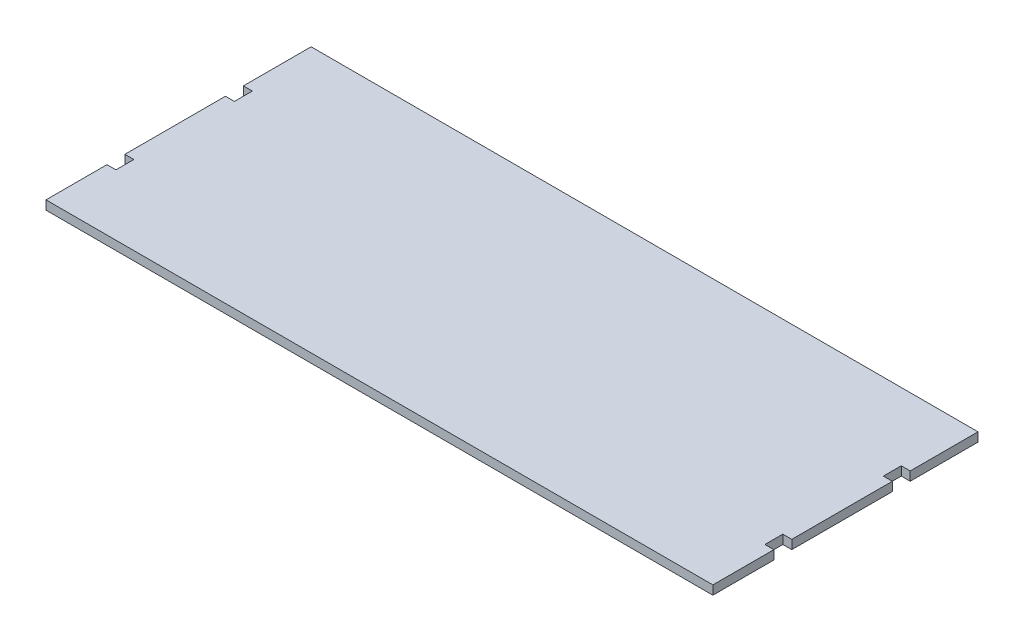
ISO-10303-21;
HEADER;
FILE_DESCRIPTION(('STEP AP214'),'2;1');
FILE_NAME('part.step','',(''),(''),'','','');
FILE_SCHEMA(('AUTOMOTIVE_DESIGN { 1 0 10303 214 1 1 1 1 }'));
ENDSEC;
DATA;
#1=APPLICATION_CONTEXT('core data for automotive mechanical design processes');
#2=APPLICATION_PROTOCOL_DEFINITION('international standard','automotive_design',2000,#1);
#3=PRODUCT_CONTEXT('',#1,'mechanical');
#4=PRODUCT('Part','Part','',(#3));
#5=PRODUCT_RELATED_PRODUCT_CATEGORY('part','',(#4));
#6=PRODUCT_DEFINITION_FORMATION('','',#4);
#7=PRODUCT_DEFINITION_CONTEXT('part definition',#1,'design');
#8=PRODUCT_DEFINITION('design','',#6,#7);
#9=PRODUCT_DEFINITION_SHAPE('','',#8);
#10=(LENGTH_UNIT() NAMED_UNIT(*) SI_UNIT(.MILLI.,.METRE.));
#11=(NAMED_UNIT(*) PLANE_ANGLE_UNIT() SI_UNIT($,.RADIAN.));
#12=(NAMED_UNIT(*) SI_UNIT($,.STERADIAN.) SOLID_ANGLE_UNIT());
#13=UNCERTAINTY_MEASURE_WITH_UNIT(LENGTH_MEASURE(1.E-05),#10,'distance_accuracy_value','');
#14=(GEOMETRIC_REPRESENTATION_CONTEXT(3) GLOBAL_UNCERTAINTY_ASSIGNED_CONTEXT((#13)) GLOBAL_UNIT_ASSIGNED_CONTEXT((#10,
#11,#12)) REPRESENTATION_CONTEXT('',''));
#15=CARTESIAN_POINT('',(0.,0.,0.));
#16=DIRECTION('',(0.,0.,1.));
#17=DIRECTION('',(1.,0.,0.));
#18=AXIS2_PLACEMENT_3D('',#15,#16,#17);
#19=CARTESIAN_POINT('',(-186.,5.,-36.145));
#20=DIRECTION('',(1.,0.,0.));
#21=DIRECTION('',(0.,0.,-1.));
#22=AXIS2_PLACEMENT_3D('',#19,#20,#21);
#23=PLANE('',#22);
#24=DIRECTION('',(0.,0.,1.));
#25=VECTOR('',#24,1.);
#26=CARTESIAN_POINT('',(-186.,0.,-36.145));
#27=LINE('',#26,#25);
#28=CARTESIAN_POINT('',(-186.,0.,-73.945));
#29=VERTEX_POINT('',#28);
#30=CARTESIAN_POINT('',(-186.,0.,-36.145));
#31=VERTEX_POINT('',#30);
#32=EDGE_CURVE('E212',#29,#31,#27,.T.);
#33=ORIENTED_EDGE('',*,*,#32,.T.);
#34=DIRECTION('',(0.,-1.,0.));
#35=VECTOR('',#34,1.);
#36=CARTESIAN_POINT('',(-186.,5.,-36.145));
#37=LINE('',#36,#35);
#38=CARTESIAN_POINT('',(-186.,5.,-36.145));
#39=VERTEX_POINT('',#38);
#40=EDGE_CURVE('E11',#39,#31,#37,.T.);
#41=ORIENTED_EDGE('',*,*,#40,.F.);
#42=DIRECTION('',(0.,0.,1.));
#43=VECTOR('',#42,1.);
#44=CARTESIAN_POINT('',(-186.,5.,-36.145));
#45=LINE('',#44,#43);
#46=CARTESIAN_POINT('',(-186.,5.,-73.945));
#47=VERTEX_POINT('',#46);
#48=EDGE_CURVE('E270',#47,#39,#45,.T.);
#49=ORIENTED_EDGE('',*,*,#48,.F.);
#50=DIRECTION('',(0.,-1.,0.));
#51=VECTOR('',#50,1.);
#52=CARTESIAN_POINT('',(-186.,5.,-73.945));
#53=LINE('',#52,#51);
#54=EDGE_CURVE('E208',#47,#29,#53,.T.);
#55=ORIENTED_EDGE('',*,*,#54,.T.);
#56=EDGE_LOOP('',(#33,#41,#49,#55));
#57=FACE_BOUND('',#56,.T.);
#58=ADVANCED_FACE('F39',(#57),#23,.F.);
#59=CARTESIAN_POINT('',(-186.,5.,-36.145));
#60=DIRECTION('',(0.,0.,-1.));
#61=DIRECTION('',(-1.,0.,0.));
#62=AXIS2_PLACEMENT_3D('',#59,#60,#61);
#63=PLANE('',#62);
#64=DIRECTION('',(1.,0.,0.));
#65=VECTOR('',#64,1.);
#66=CARTESIAN_POINT('',(-186.,0.,-36.145));
#67=LINE('',#66,#65);
#68=CARTESIAN_POINT('',(-181.,0.,-36.145));
#69=VERTEX_POINT('',#68);
#70=EDGE_CURVE('E216',#31,#69,#67,.T.);
#71=ORIENTED_EDGE('',*,*,#70,.T.);
#72=DIRECTION('',(0.,-1.,0.));
#73=VECTOR('',#72,1.);
#74=CARTESIAN_POINT('',(-181.,5.,-36.145));
#75=LINE('',#74,#73);
#76=CARTESIAN_POINT('',(-181.,5.,-36.145));
#77=VERTEX_POINT('',#76);
#78=EDGE_CURVE('E48',#77,#69,#75,.T.);
#79=ORIENTED_EDGE('',*,*,#78,.F.);
#80=DIRECTION('',(1.,0.,0.));
#81=VECTOR('',#80,1.);
#82=CARTESIAN_POINT('',(-186.,5.,-36.145));
#83=LINE('',#82,#81);
#84=EDGE_CURVE('E135',#39,#77,#83,.T.);
#85=ORIENTED_EDGE('',*,*,#84,.F.);
#86=ORIENTED_EDGE('',*,*,#40,.T.);
#87=EDGE_LOOP('',(#71,#79,#85,#86));
#88=FACE_BOUND('',#87,.T.);
#89=ADVANCED_FACE('F420',(#88),#63,.F.);
#90=CARTESIAN_POINT('',(-181.,5.,-36.145));
#91=DIRECTION('',(1.,0.,0.));
#92=DIRECTION('',(0.,0.,-1.));
#93=AXIS2_PLACEMENT_3D('',#90,#91,#92);
#94=PLANE('',#93);
#95=DIRECTION('',(0.,0.,1.));
#96=VECTOR('',#95,1.);
#97=CARTESIAN_POINT('',(-181.,0.,-36.145));
#98=LINE('',#97,#96);
#99=CARTESIAN_POINT('',(-181.,0.,-26.145));
#100=VERTEX_POINT('',#99);
#101=EDGE_CURVE('E219',#69,#100,#98,.T.);
#102=ORIENTED_EDGE('',*,*,#101,.T.);
#103=DIRECTION('',(0.,-1.,0.));
#104=VECTOR('',#103,1.);
#105=CARTESIAN_POINT('',(-181.,5.,-26.145));
#106=LINE('',#105,#104);
#107=CARTESIAN_POINT('',(-181.,5.,-26.145));
#108=VERTEX_POINT('',#107);
#109=EDGE_CURVE('E329',#108,#100,#106,.T.);
#110=ORIENTED_EDGE('',*,*,#109,.F.);
#111=DIRECTION('',(0.,0.,1.));
#112=VECTOR('',#111,1.);
#113=CARTESIAN_POINT('',(-181.,5.,-36.145));
#114=LINE('',#113,#112);
#115=EDGE_CURVE('E339',#77,#108,#114,.T.);
#116=ORIENTED_EDGE('',*,*,#115,.F.);
#117=ORIENTED_EDGE('',*,*,#78,.T.);
#118=EDGE_LOOP('',(#102,#110,#116,#117));
#119=FACE_BOUND('',#118,.T.);
#120=ADVANCED_FACE('F337',(#119),#94,.F.);
#121=CARTESIAN_POINT('',(-181.,5.,-26.145));
#122=DIRECTION('',(0.,0.,1.));
#123=DIRECTION('',(1.,0.,0.));
#124=AXIS2_PLACEMENT_3D('',#121,#122,#123);
#125=PLANE('',#124);
#126=DIRECTION('',(-1.,0.,0.));
#127=VECTOR('',#126,1.);
#128=CARTESIAN_POINT('',(-181.,0.,-26.145));
#129=LINE('',#128,#127);
#130=CARTESIAN_POINT('',(-186.,0.,-26.145));
#131=VERTEX_POINT('',#130);
#132=EDGE_CURVE('E222',#100,#131,#129,.T.);
#133=ORIENTED_EDGE('',*,*,#132,.T.);
#134=DIRECTION('',(0.,-1.,0.));
#135=VECTOR('',#134,1.);
#136=CARTESIAN_POINT('',(-186.,5.,-26.145));
#137=LINE('',#136,#135);
#138=CARTESIAN_POINT('',(-186.,5.,-26.145));
#139=VERTEX_POINT('',#138);
#140=EDGE_CURVE('E325',#139,#131,#137,.T.);
#141=ORIENTED_EDGE('',*,*,#140,.F.);
#142=DIRECTION('',(-1.,0.,0.));
#143=VECTOR('',#142,1.);
#144=CARTESIAN_POINT('',(-181.,5.,-26.145));
#145=LINE('',#144,#143);
#146=EDGE_CURVE('E358',#108,#139,#145,.T.);
#147=ORIENTED_EDGE('',*,*,#146,.F.);
#148=ORIENTED_EDGE('',*,*,#109,.T.);
#149=EDGE_LOOP('',(#133,#141,#147,#148));
#150=FACE_BOUND('',#149,.T.);
#151=ADVANCED_FACE('F348',(#150),#125,.F.);
#152=CARTESIAN_POINT('',(-186.,5.,29.945));
#153=DIRECTION('',(1.,0.,0.));
#154=DIRECTION('',(0.,0.,-1.));
#155=AXIS2_PLACEMENT_3D('',#152,#153,#154);
#156=PLANE('',#155);
#157=DIRECTION('',(0.,0.,1.));
#158=VECTOR('',#157,1.);
#159=CARTESIAN_POINT('',(-186.,0.,29.945));
#160=LINE('',#159,#158);
#161=CARTESIAN_POINT('',(-186.,0.,29.945));
#162=VERTEX_POINT('',#161);
#163=EDGE_CURVE('E225',#131,#162,#160,.T.);
#164=ORIENTED_EDGE('',*,*,#163,.T.);
#165=DIRECTION('',(0.,-1.,0.));
#166=VECTOR('',#165,1.);
#167=CARTESIAN_POINT('',(-186.,5.,29.945));
#168=LINE('',#167,#166);
#169=CARTESIAN_POINT('',(-186.,5.,29.945));
#170=VERTEX_POINT('',#169);
#171=EDGE_CURVE('E321',#170,#162,#168,.T.);
#172=ORIENTED_EDGE('',*,*,#171,.F.);
#173=DIRECTION('',(0.,0.,1.));
#174=VECTOR('',#173,1.);
#175=CARTESIAN_POINT('',(-186.,5.,29.945));
#176=LINE('',#175,#174);
#177=EDGE_CURVE('E354',#139,#170,#176,.T.);
#178=ORIENTED_EDGE('',*,*,#177,.F.);
#179=ORIENTED_EDGE('',*,*,#140,.T.);
#180=EDGE_LOOP('',(#164,#172,#178,#179));
#181=FACE_BOUND('',#180,.T.);
#182=ADVANCED_FACE('F352',(#181),#156,.F.);
#183=CARTESIAN_POINT('',(-181.,5.,29.945));
#184=DIRECTION('',(0.,0.,-1.));
#185=DIRECTION('',(-1.,0.,0.));
#186=AXIS2_PLACEMENT_3D('',#183,#184,#185);
#187=PLANE('',#186);
#188=DIRECTION('',(1.,0.,0.));
#189=VECTOR('',#188,1.);
#190=CARTESIAN_POINT('',(-181.,0.,29.945));
#191=LINE('',#190,#189);
#192=CARTESIAN_POINT('',(-181.,0.,29.945));
#193=VERTEX_POINT('',#192);
#194=EDGE_CURVE('E228',#162,#193,#191,.T.);
#195=ORIENTED_EDGE('',*,*,#194,.T.);
#196=DIRECTION('',(0.,-1.,0.));
#197=VECTOR('',#196,1.);
#198=CARTESIAN_POINT('',(-181.,5.,29.945));
#199=LINE('',#198,#197);
#200=CARTESIAN_POINT('',(-181.,5.,29.945));
#201=VERTEX_POINT('',#200);
#202=EDGE_CURVE('E317',#201,#193,#199,.T.);
#203=ORIENTED_EDGE('',*,*,#202,.F.);
#204=DIRECTION('',(1.,0.,0.));
#205=VECTOR('',#204,1.);
#206=CARTESIAN_POINT('',(-181.,5.,29.945));
#207=LINE('',#206,#205);
#208=EDGE_CURVE('E357',#170,#201,#207,.T.);
#209=ORIENTED_EDGE('',*,*,#208,.F.);
#210=ORIENTED_EDGE('',*,*,#171,.T.);
#211=EDGE_LOOP('',(#195,#203,#209,#210));
#212=FACE_BOUND('',#211,.T.);
#213=ADVANCED_FACE('F433',(#212),#187,.F.);
#214=CARTESIAN_POINT('',(-181.,5.,39.945));
#215=DIRECTION('',(1.,0.,0.));
#216=DIRECTION('',(0.,0.,-1.));
#217=AXIS2_PLACEMENT_3D('',#214,#215,#216);
#218=PLANE('',#217);
#219=DIRECTION('',(0.,0.,1.));
#220=VECTOR('',#219,1.);
#221=CARTESIAN_POINT('',(-181.,0.,39.945));
#222=LINE('',#221,#220);
#223=CARTESIAN_POINT('',(-181.,0.,39.945));
#224=VERTEX_POINT('',#223);
#225=EDGE_CURVE('E231',#193,#224,#222,.T.);
#226=ORIENTED_EDGE('',*,*,#225,.T.);
#227=DIRECTION('',(0.,-1.,0.));
#228=VECTOR('',#227,1.);
#229=CARTESIAN_POINT('',(-181.,5.,39.945));
#230=LINE('',#229,#228);
#231=CARTESIAN_POINT('',(-181.,5.,39.945));
#232=VERTEX_POINT('',#231);
#233=EDGE_CURVE('E313',#232,#224,#230,.T.);
#234=ORIENTED_EDGE('',*,*,#233,.F.);
#235=DIRECTION('',(0.,0.,1.));
#236=VECTOR('',#235,1.);
#237=CARTESIAN_POINT('',(-181.,5.,39.945));
#238=LINE('',#237,#236);
#239=EDGE_CURVE('E362',#201,#232,#238,.T.);
#240=ORIENTED_EDGE('',*,*,#239,.F.);
#241=ORIENTED_EDGE('',*,*,#202,.T.);
#242=EDGE_LOOP('',(#226,#234,#240,#241));
#243=FACE_BOUND('',#242,.T.);
#244=ADVANCED_FACE('F436',(#243),#218,.F.);
#245=CARTESIAN_POINT('',(-186.,5.,39.945));
#246=DIRECTION('',(0.,0.,1.));
#247=DIRECTION('',(1.,0.,0.));
#248=AXIS2_PLACEMENT_3D('',#245,#246,#247);
#249=PLANE('',#248);
#250=DIRECTION('',(-1.,0.,0.));
#251=VECTOR('',#250,1.);
#252=CARTESIAN_POINT('',(-186.,0.,39.945));
#253=LINE('',#252,#251);
#254=CARTESIAN_POINT('',(-186.,0.,39.945));
#255=VERTEX_POINT('',#254);
#256=EDGE_CURVE('E234',#224,#255,#253,.T.);
#257=ORIENTED_EDGE('',*,*,#256,.T.);
#258=DIRECTION('',(0.,-1.,0.));
#259=VECTOR('',#258,1.);
#260=CARTESIAN_POINT('',(-186.,5.,39.945));
#261=LINE('',#260,#259);
#262=CARTESIAN_POINT('',(-186.,5.,39.945));
#263=VERTEX_POINT('',#262);
#264=EDGE_CURVE('E309',#263,#255,#261,.T.);
#265=ORIENTED_EDGE('',*,*,#264,.F.);
#266=DIRECTION('',(-1.,0.,0.));
#267=VECTOR('',#266,1.);
#268=CARTESIAN_POINT('',(-186.,5.,39.945));
#269=LINE('',#268,#267);
#270=EDGE_CURVE('E369',#232,#263,#269,.T.);
#271=ORIENTED_EDGE('',*,*,#270,.F.);
#272=ORIENTED_EDGE('',*,*,#233,.T.);
#273=EDGE_LOOP('',(#257,#265,#271,#272));
#274=FACE_BOUND('',#273,.T.);
#275=ADVANCED_FACE('F440',(#274),#249,.F.);
#276=CARTESIAN_POINT('',(-186.,5.,73.945));
#277=DIRECTION('',(1.,0.,0.));
#278=DIRECTION('',(0.,0.,-1.));
#279=AXIS2_PLACEMENT_3D('',#276,#277,#278);
#280=PLANE('',#279);
#281=DIRECTION('',(0.,0.,1.));
#282=VECTOR('',#281,1.);
#283=CARTESIAN_POINT('',(-186.,0.,73.945));
#284=LINE('',#283,#282);
#285=CARTESIAN_POINT('',(-186.,0.,73.945));
#286=VERTEX_POINT('',#285);
#287=EDGE_CURVE('E237',#255,#286,#284,.T.);
#288=ORIENTED_EDGE('',*,*,#287,.T.);
#289=DIRECTION('',(0.,-1.,0.));
#290=VECTOR('',#289,1.);
#291=CARTESIAN_POINT('',(-186.,5.,73.945));
#292=LINE('',#291,#290);
#293=CARTESIAN_POINT('',(-186.,5.,73.945));
#294=VERTEX_POINT('',#293);
#295=EDGE_CURVE('E305',#294,#286,#292,.T.);
#296=ORIENTED_EDGE('',*,*,#295,.F.);
#297=DIRECTION('',(0.,0.,1.));
#298=VECTOR('',#297,1.);
#299=CARTESIAN_POINT('',(-186.,5.,73.945));
#300=LINE('',#299,#298);
#301=EDGE_CURVE('E372',#263,#294,#300,.T.);
#302=ORIENTED_EDGE('',*,*,#301,.F.);
#303=ORIENTED_EDGE('',*,*,#264,.T.);
#304=EDGE_LOOP('',(#288,#296,#302,#303));
#305=FACE_BOUND('',#304,.T.);
#306=ADVANCED_FACE('F444',(#305),#280,.F.);
#307=CARTESIAN_POINT('',(186.,5.,73.945));
#308=DIRECTION('',(0.,0.,-1.));
#309=DIRECTION('',(-1.,0.,0.));
#310=AXIS2_PLACEMENT_3D('',#307,#308,#309);
#311=PLANE('',#310);
#312=DIRECTION('',(1.,0.,0.));
#313=VECTOR('',#312,1.);
#314=CARTESIAN_POINT('',(186.,0.,73.945));
#315=LINE('',#314,#313);
#316=CARTESIAN_POINT('',(186.,0.,73.945));
#317=VERTEX_POINT('',#316);
#318=EDGE_CURVE('E240',#286,#317,#315,.T.);
#319=ORIENTED_EDGE('',*,*,#318,.T.);
#320=DIRECTION('',(0.,-1.,0.));
#321=VECTOR('',#320,1.);
#322=CARTESIAN_POINT('',(186.,5.,73.945));
#323=LINE('',#322,#321);
#324=CARTESIAN_POINT('',(186.,5.,73.945));
#325=VERTEX_POINT('',#324);
#326=EDGE_CURVE('E301',#325,#317,#323,.T.);
#327=ORIENTED_EDGE('',*,*,#326,.F.);
#328=DIRECTION('',(1.,0.,0.));
#329=VECTOR('',#328,1.);
#330=CARTESIAN_POINT('',(186.,5.,73.945));
#331=LINE('',#330,#329);
#332=EDGE_CURVE('E375',#294,#325,#331,.T.);
#333=ORIENTED_EDGE('',*,*,#332,.F.);
#334=ORIENTED_EDGE('',*,*,#295,.T.);
#335=EDGE_LOOP('',(#319,#327,#333,#334));
#336=FACE_BOUND('',#335,.T.);
#337=ADVANCED_FACE('F448',(#336),#311,.F.);
#338=CARTESIAN_POINT('',(186.,5.,73.945));
#339=DIRECTION('',(-1.,0.,0.));
#340=DIRECTION('',(0.,0.,1.));
#341=AXIS2_PLACEMENT_3D('',#338,#339,#340);
#342=PLANE('',#341);
#343=DIRECTION('',(0.,0.,-1.));
#344=VECTOR('',#343,1.);
#345=CARTESIAN_POINT('',(186.,0.,73.945));
#346=LINE('',#345,#344);
#347=CARTESIAN_POINT('',(186.,0.,39.945));
#348=VERTEX_POINT('',#347);
#349=EDGE_CURVE('E243',#317,#348,#346,.T.);
#350=ORIENTED_EDGE('',*,*,#349,.T.);
#351=DIRECTION('',(0.,-1.,0.));
#352=VECTOR('',#351,1.);
#353=CARTESIAN_POINT('',(186.,5.,39.945));
#354=LINE('',#353,#352);
#355=CARTESIAN_POINT('',(186.,5.,39.945));
#356=VERTEX_POINT('',#355);
#357=EDGE_CURVE('E297',#356,#348,#354,.T.);
#358=ORIENTED_EDGE('',*,*,#357,.F.);
#359=DIRECTION('',(0.,0.,-1.));
#360=VECTOR('',#359,1.);
#361=CARTESIAN_POINT('',(186.,5.,73.945));
#362=LINE('',#361,#360);
#363=EDGE_CURVE('E378',#325,#356,#362,.T.);
#364=ORIENTED_EDGE('',*,*,#363,.F.);
#365=ORIENTED_EDGE('',*,*,#326,.T.);
#366=EDGE_LOOP('',(#350,#358,#364,#365));
#367=FACE_BOUND('',#366,.T.);
#368=ADVANCED_FACE('F452',(#367),#342,.F.);
#369=CARTESIAN_POINT('',(186.,5.,39.945));
#370=DIRECTION('',(0.,0.,1.));
#371=DIRECTION('',(1.,0.,0.));
#372=AXIS2_PLACEMENT_3D('',#369,#370,#371);
#373=PLANE('',#372);
#374=DIRECTION('',(-1.,0.,0.));
#375=VECTOR('',#374,1.);
#376=CARTESIAN_POINT('',(186.,0.,39.945));
#377=LINE('',#376,#375);
#378=CARTESIAN_POINT('',(181.,0.,39.945));
#379=VERTEX_POINT('',#378);
#380=EDGE_CURVE('E246',#348,#379,#377,.T.);
#381=ORIENTED_EDGE('',*,*,#380,.T.);
#382=DIRECTION('',(0.,-1.,0.));
#383=VECTOR('',#382,1.);
#384=CARTESIAN_POINT('',(181.,5.,39.945));
#385=LINE('',#384,#383);
#386=CARTESIAN_POINT('',(181.,5.,39.945));
#387=VERTEX_POINT('',#386);
#388=EDGE_CURVE('E293',#387,#379,#385,.T.);
#389=ORIENTED_EDGE('',*,*,#388,.F.);
#390=DIRECTION('',(-1.,0.,0.));
#391=VECTOR('',#390,1.);
#392=CARTESIAN_POINT('',(186.,5.,39.945));
#393=LINE('',#392,#391);
#394=EDGE_CURVE('E381',#356,#387,#393,.T.);
#395=ORIENTED_EDGE('',*,*,#394,.F.);
#396=ORIENTED_EDGE('',*,*,#357,.T.);
#397=EDGE_LOOP('',(#381,#389,#395,#396));
#398=FACE_BOUND('',#397,.T.);
#399=ADVANCED_FACE('F456',(#398),#373,.F.);
#400=CARTESIAN_POINT('',(181.,5.,39.945));
#401=DIRECTION('',(-1.,0.,0.));
#402=DIRECTION('',(0.,0.,1.));
#403=AXIS2_PLACEMENT_3D('',#400,#401,#402);
#404=PLANE('',#403);
#405=DIRECTION('',(0.,0.,-1.));
#406=VECTOR('',#405,1.);
#407=CARTESIAN_POINT('',(181.,0.,39.945));
#408=LINE('',#407,#406);
#409=CARTESIAN_POINT('',(181.,0.,29.945));
#410=VERTEX_POINT('',#409);
#411=EDGE_CURVE('E249',#379,#410,#408,.T.);
#412=ORIENTED_EDGE('',*,*,#411,.T.);
#413=DIRECTION('',(0.,-1.,0.));
#414=VECTOR('',#413,1.);
#415=CARTESIAN_POINT('',(181.,5.,29.945));
#416=LINE('',#415,#414);
#417=CARTESIAN_POINT('',(181.,5.,29.945));
#418=VERTEX_POINT('',#417);
#419=EDGE_CURVE('E289',#418,#410,#416,.T.);
#420=ORIENTED_EDGE('',*,*,#419,.F.);
#421=DIRECTION('',(0.,0.,-1.));
#422=VECTOR('',#421,1.);
#423=CARTESIAN_POINT('',(181.,5.,39.945));
#424=LINE('',#423,#422);
#425=EDGE_CURVE('E384',#387,#418,#424,.T.);
#426=ORIENTED_EDGE('',*,*,#425,.F.);
#427=ORIENTED_EDGE('',*,*,#388,.T.);
#428=EDGE_LOOP('',(#412,#420,#426,#427));
#429=FACE_BOUND('',#428,.T.);
#430=ADVANCED_FACE('F460',(#429),#404,.F.);
#431=CARTESIAN_POINT('',(181.,5.,29.945));
#432=DIRECTION('',(0.,0.,-1.));
#433=DIRECTION('',(-1.,0.,0.));
#434=AXIS2_PLACEMENT_3D('',#431,#432,#433);
#435=PLANE('',#434);
#436=DIRECTION('',(1.,0.,0.));
#437=VECTOR('',#436,1.);
#438=CARTESIAN_POINT('',(181.,0.,29.945));
#439=LINE('',#438,#437);
#440=CARTESIAN_POINT('',(186.,0.,29.945));
#441=VERTEX_POINT('',#440);
#442=EDGE_CURVE('E252',#410,#441,#439,.T.);
#443=ORIENTED_EDGE('',*,*,#442,.T.);
#444=DIRECTION('',(0.,-1.,0.));
#445=VECTOR('',#444,1.);
#446=CARTESIAN_POINT('',(186.,5.,29.945));
#447=LINE('',#446,#445);
#448=CARTESIAN_POINT('',(186.,5.,29.945));
#449=VERTEX_POINT('',#448);
#450=EDGE_CURVE('E285',#449,#441,#447,.T.);
#451=ORIENTED_EDGE('',*,*,#450,.F.);
#452=DIRECTION('',(1.,0.,0.));
#453=VECTOR('',#452,1.);
#454=CARTESIAN_POINT('',(181.,5.,29.945));
#455=LINE('',#454,#453);
#456=EDGE_CURVE('E387',#418,#449,#455,.T.);
#457=ORIENTED_EDGE('',*,*,#456,.F.);
#458=ORIENTED_EDGE('',*,*,#419,.T.);
#459=EDGE_LOOP('',(#443,#451,#457,#458));
#460=FACE_BOUND('',#459,.T.);
#461=ADVANCED_FACE('F464',(#460),#435,.F.);
#462=CARTESIAN_POINT('',(186.,5.,29.945));
#463=DIRECTION('',(-1.,0.,0.));
#464=DIRECTION('',(0.,0.,1.));
#465=AXIS2_PLACEMENT_3D('',#462,#463,#464);
#466=PLANE('',#465);
#467=DIRECTION('',(0.,0.,-1.));
#468=VECTOR('',#467,1.);
#469=CARTESIAN_POINT('',(186.,0.,29.945));
#470=LINE('',#469,#468);
#471=CARTESIAN_POINT('',(186.,0.,-26.145));
#472=VERTEX_POINT('',#471);
#473=EDGE_CURVE('E255',#441,#472,#470,.T.);
#474=ORIENTED_EDGE('',*,*,#473,.T.);
#475=DIRECTION('',(0.,-1.,0.));
#476=VECTOR('',#475,1.);
#477=CARTESIAN_POINT('',(186.,5.,-26.145));
#478=LINE('',#477,#476);
#479=CARTESIAN_POINT('',(186.,5.,-26.145));
#480=VERTEX_POINT('',#479);
#481=EDGE_CURVE('E281',#480,#472,#478,.T.);
#482=ORIENTED_EDGE('',*,*,#481,.F.);
#483=DIRECTION('',(0.,0.,-1.));
#484=VECTOR('',#483,1.);
#485=CARTESIAN_POINT('',(186.,5.,29.945));
#486=LINE('',#485,#484);
#487=EDGE_CURVE('E390',#449,#480,#486,.T.);
#488=ORIENTED_EDGE('',*,*,#487,.F.);
#489=ORIENTED_EDGE('',*,*,#450,.T.);
#490=EDGE_LOOP('',(#474,#482,#488,#489));
#491=FACE_BOUND('',#490,.T.);
#492=ADVANCED_FACE('F468',(#491),#466,.F.);
#493=CARTESIAN_POINT('',(181.,5.,-26.145));
#494=DIRECTION('',(0.,0.,1.));
#495=DIRECTION('',(1.,0.,0.));
#496=AXIS2_PLACEMENT_3D('',#493,#494,#495);
#497=PLANE('',#496);
#498=DIRECTION('',(-1.,0.,0.));
#499=VECTOR('',#498,1.);
#500=CARTESIAN_POINT('',(181.,0.,-26.145));
#501=LINE('',#500,#499);
#502=CARTESIAN_POINT('',(181.,0.,-26.145));
#503=VERTEX_POINT('',#502);
#504=EDGE_CURVE('E258',#472,#503,#501,.T.);
#505=ORIENTED_EDGE('',*,*,#504,.T.);
#506=DIRECTION('',(0.,-1.,0.));
#507=VECTOR('',#506,1.);
#508=CARTESIAN_POINT('',(181.,5.,-26.145));
#509=LINE('',#508,#507);
#510=CARTESIAN_POINT('',(181.,5.,-26.145));
#511=VERTEX_POINT('',#510);
#512=EDGE_CURVE('E277',#511,#503,#509,.T.);
#513=ORIENTED_EDGE('',*,*,#512,.F.);
#514=DIRECTION('',(-1.,0.,0.));
#515=VECTOR('',#514,1.);
#516=CARTESIAN_POINT('',(181.,5.,-26.145));
#517=LINE('',#516,#515);
#518=EDGE_CURVE('E393',#480,#511,#517,.T.);
#519=ORIENTED_EDGE('',*,*,#518,.F.);
#520=ORIENTED_EDGE('',*,*,#481,.T.);
#521=EDGE_LOOP('',(#505,#513,#519,#520));
#522=FACE_BOUND('',#521,.T.);
#523=ADVANCED_FACE('F401',(#522),#497,.F.);
#524=CARTESIAN_POINT('',(181.,5.,-36.145));
#525=DIRECTION('',(-1.,0.,0.));
#526=DIRECTION('',(0.,0.,1.));
#527=AXIS2_PLACEMENT_3D('',#524,#525,#526);
#528=PLANE('',#527);
#529=DIRECTION('',(0.,0.,-1.));
#530=VECTOR('',#529,1.);
#531=CARTESIAN_POINT('',(181.,0.,-36.145));
#532=LINE('',#531,#530);
#533=CARTESIAN_POINT('',(181.,0.,-36.145));
#534=VERTEX_POINT('',#533);
#535=EDGE_CURVE('E261',#503,#534,#532,.T.);
#536=ORIENTED_EDGE('',*,*,#535,.T.);
#537=DIRECTION('',(0.,-1.,0.));
#538=VECTOR('',#537,1.);
#539=CARTESIAN_POINT('',(181.,5.,-36.145));
#540=LINE('',#539,#538);
#541=CARTESIAN_POINT('',(181.,5.,-36.145));
#542=VERTEX_POINT('',#541);
#543=EDGE_CURVE('E201',#542,#534,#540,.T.);
#544=ORIENTED_EDGE('',*,*,#543,.F.);
#545=DIRECTION('',(0.,0.,-1.));
#546=VECTOR('',#545,1.);
#547=CARTESIAN_POINT('',(181.,5.,-36.145));
#548=LINE('',#547,#546);
#549=EDGE_CURVE('E190',#511,#542,#548,.T.);
#550=ORIENTED_EDGE('',*,*,#549,.F.);
#551=ORIENTED_EDGE('',*,*,#512,.T.);
#552=EDGE_LOOP('',(#536,#544,#550,#551));
#553=FACE_BOUND('',#552,.T.);
#554=ADVANCED_FACE('F405',(#553),#528,.F.);
#555=CARTESIAN_POINT('',(186.,5.,-36.145));
#556=DIRECTION('',(0.,0.,-1.));
#557=DIRECTION('',(-1.,0.,0.));
#558=AXIS2_PLACEMENT_3D('',#555,#556,#557);
#559=PLANE('',#558);
#560=DIRECTION('',(1.,0.,0.));
#561=VECTOR('',#560,1.);
#562=CARTESIAN_POINT('',(186.,0.,-36.145));
#563=LINE('',#562,#561);
#564=CARTESIAN_POINT('',(186.,0.,-36.145));
#565=VERTEX_POINT('',#564);
#566=EDGE_CURVE('E199',#534,#565,#563,.T.);
#567=ORIENTED_EDGE('',*,*,#566,.T.);
#568=DIRECTION('',(0.,-1.,0.));
#569=VECTOR('',#568,1.);
#570=CARTESIAN_POINT('',(186.,5.,-36.145));
#571=LINE('',#570,#569);
#572=CARTESIAN_POINT('',(186.,5.,-36.145));
#573=VERTEX_POINT('',#572);
#574=EDGE_CURVE('E196',#573,#565,#571,.T.);
#575=ORIENTED_EDGE('',*,*,#574,.F.);
#576=DIRECTION('',(1.,0.,0.));
#577=VECTOR('',#576,1.);
#578=CARTESIAN_POINT('',(186.,5.,-36.145));
#579=LINE('',#578,#577);
#580=EDGE_CURVE('E184',#542,#573,#579,.T.);
#581=ORIENTED_EDGE('',*,*,#580,.F.);
#582=ORIENTED_EDGE('',*,*,#543,.T.);
#583=EDGE_LOOP('',(#567,#575,#581,#582));
#584=FACE_BOUND('',#583,.T.);
#585=ADVANCED_FACE('F197',(#584),#559,.F.);
#586=CARTESIAN_POINT('',(186.,5.,-36.145));
#587=DIRECTION('',(-1.,0.,0.));
#588=DIRECTION('',(0.,0.,1.));
#589=AXIS2_PLACEMENT_3D('',#586,#587,#588);
#590=PLANE('',#589);
#591=DIRECTION('',(0.,0.,-1.));
#592=VECTOR('',#591,1.);
#593=CARTESIAN_POINT('',(186.,0.,-36.145));
#594=LINE('',#593,#592);
#595=CARTESIAN_POINT('',(186.,0.,-73.945));
#596=VERTEX_POINT('',#595);
#597=EDGE_CURVE('E121',#565,#596,#594,.T.);
#598=ORIENTED_EDGE('',*,*,#597,.T.);
#599=DIRECTION('',(0.,-1.,0.));
#600=VECTOR('',#599,1.);
#601=CARTESIAN_POINT('',(186.,5.,-73.945));
#602=LINE('',#601,#600);
#603=CARTESIAN_POINT('',(186.,5.,-73.945));
#604=VERTEX_POINT('',#603);
#605=EDGE_CURVE('E202',#604,#596,#602,.T.);
#606=ORIENTED_EDGE('',*,*,#605,.F.);
#607=DIRECTION('',(0.,0.,-1.));
#608=VECTOR('',#607,1.);
#609=CARTESIAN_POINT('',(186.,5.,-36.145));
#610=LINE('',#609,#608);
#611=EDGE_CURVE('E188',#573,#604,#610,.T.);
#612=ORIENTED_EDGE('',*,*,#611,.F.);
#613=ORIENTED_EDGE('',*,*,#574,.T.);
#614=EDGE_LOOP('',(#598,#606,#612,#613));
#615=FACE_BOUND('',#614,.T.);
#616=ADVANCED_FACE('F204',(#615),#590,.F.);
#617=CARTESIAN_POINT('',(186.,5.,-73.945));
#618=DIRECTION('',(0.,0.,1.));
#619=DIRECTION('',(1.,0.,0.));
#620=AXIS2_PLACEMENT_3D('',#617,#618,#619);
#621=PLANE('',#620);
#622=DIRECTION('',(-1.,0.,0.));
#623=VECTOR('',#622,1.);
#624=CARTESIAN_POINT('',(186.,0.,-73.945));
#625=LINE('',#624,#623);
#626=EDGE_CURVE('E127',#596,#29,#625,.T.);
#627=ORIENTED_EDGE('',*,*,#626,.T.);
#628=ORIENTED_EDGE('',*,*,#54,.F.);
#629=DIRECTION('',(-1.,0.,0.));
#630=VECTOR('',#629,1.);
#631=CARTESIAN_POINT('',(186.,5.,-73.945));
#632=LINE('',#631,#630);
#633=EDGE_CURVE('E56',#604,#47,#632,.T.);
#634=ORIENTED_EDGE('',*,*,#633,.F.);
#635=ORIENTED_EDGE('',*,*,#605,.T.);
#636=EDGE_LOOP('',(#627,#628,#634,#635));
#637=FACE_BOUND('',#636,.T.);
#638=ADVANCED_FACE('F409',(#637),#621,.F.);
#639=CARTESIAN_POINT('',(0.,5.,0.));
#640=DIRECTION('',(0.,1.,0.));
#641=DIRECTION('',(0.,0.,1.));
#642=AXIS2_PLACEMENT_3D('',#639,#640,#641);
#643=PLANE('',#642);
#644=ORIENTED_EDGE('',*,*,#48,.T.);
#645=ORIENTED_EDGE('',*,*,#84,.T.);
#646=ORIENTED_EDGE('',*,*,#115,.T.);
#647=ORIENTED_EDGE('',*,*,#146,.T.);
#648=ORIENTED_EDGE('',*,*,#177,.T.);
#649=ORIENTED_EDGE('',*,*,#208,.T.);
#650=ORIENTED_EDGE('',*,*,#239,.T.);
#651=ORIENTED_EDGE('',*,*,#270,.T.);
#652=ORIENTED_EDGE('',*,*,#301,.T.);
#653=ORIENTED_EDGE('',*,*,#332,.T.);
#654=ORIENTED_EDGE('',*,*,#363,.T.);
#655=ORIENTED_EDGE('',*,*,#394,.T.);
#656=ORIENTED_EDGE('',*,*,#425,.T.);
#657=ORIENTED_EDGE('',*,*,#456,.T.);
#658=ORIENTED_EDGE('',*,*,#487,.T.);
#659=ORIENTED_EDGE('',*,*,#518,.T.);
#660=ORIENTED_EDGE('',*,*,#549,.T.);
#661=ORIENTED_EDGE('',*,*,#580,.T.);
#662=ORIENTED_EDGE('',*,*,#611,.T.);
#663=ORIENTED_EDGE('',*,*,#633,.T.);
#664=EDGE_LOOP('',(#644,#645,#646,#647,#648,#649,#650,#651,#652,#653,#654,#655,#656,#657,#658,
#659,#660,#661,#662,#663));
#665=FACE_BOUND('',#664,.T.);
#666=ADVANCED_FACE('F186',(#665),#643,.T.);
#667=CARTESIAN_POINT('',(0.,0.,0.));
#668=DIRECTION('',(0.,1.,0.));
#669=DIRECTION('',(0.,0.,1.));
#670=AXIS2_PLACEMENT_3D('',#667,#668,#669);
#671=PLANE('',#670);
#672=ORIENTED_EDGE('',*,*,#32,.F.);
#673=ORIENTED_EDGE('',*,*,#626,.F.);
#674=ORIENTED_EDGE('',*,*,#597,.F.);
#675=ORIENTED_EDGE('',*,*,#566,.F.);
#676=ORIENTED_EDGE('',*,*,#535,.F.);
#677=ORIENTED_EDGE('',*,*,#504,.F.);
#678=ORIENTED_EDGE('',*,*,#473,.F.);
#679=ORIENTED_EDGE('',*,*,#442,.F.);
#680=ORIENTED_EDGE('',*,*,#411,.F.);
#681=ORIENTED_EDGE('',*,*,#380,.F.);
#682=ORIENTED_EDGE('',*,*,#349,.F.);
#683=ORIENTED_EDGE('',*,*,#318,.F.);
#684=ORIENTED_EDGE('',*,*,#287,.F.);
#685=ORIENTED_EDGE('',*,*,#256,.F.);
#686=ORIENTED_EDGE('',*,*,#225,.F.);
#687=ORIENTED_EDGE('',*,*,#194,.F.);
#688=ORIENTED_EDGE('',*,*,#163,.F.);
#689=ORIENTED_EDGE('',*,*,#132,.F.);
#690=ORIENTED_EDGE('',*,*,#101,.F.);
#691=ORIENTED_EDGE('',*,*,#70,.F.);
#692=EDGE_LOOP('',(#672,#673,#674,#675,#676,#677,#678,#679,#680,#681,#682,#683,#684,#685,#686,
#687,#688,#689,#690,#691));
#693=FACE_BOUND('',#692,.T.);
#694=ADVANCED_FACE('F343',(#693),#671,.F.);
#695=CLOSED_SHELL('',(#58,#89,#120,#151,#182,#213,#244,#275,#306,#337,#368,#399,#430,#461,#492,
#523,#554,#585,#616,#638,#666,#694));
#696=MANIFOLD_SOLID_BREP('B2',#695);
#697=ADVANCED_BREP_SHAPE_REPRESENTATION('',(#18,#696),#14);
#698=SHAPE_DEFINITION_REPRESENTATION(#9,#697);
ENDSEC;
END-ISO-10303-21;
